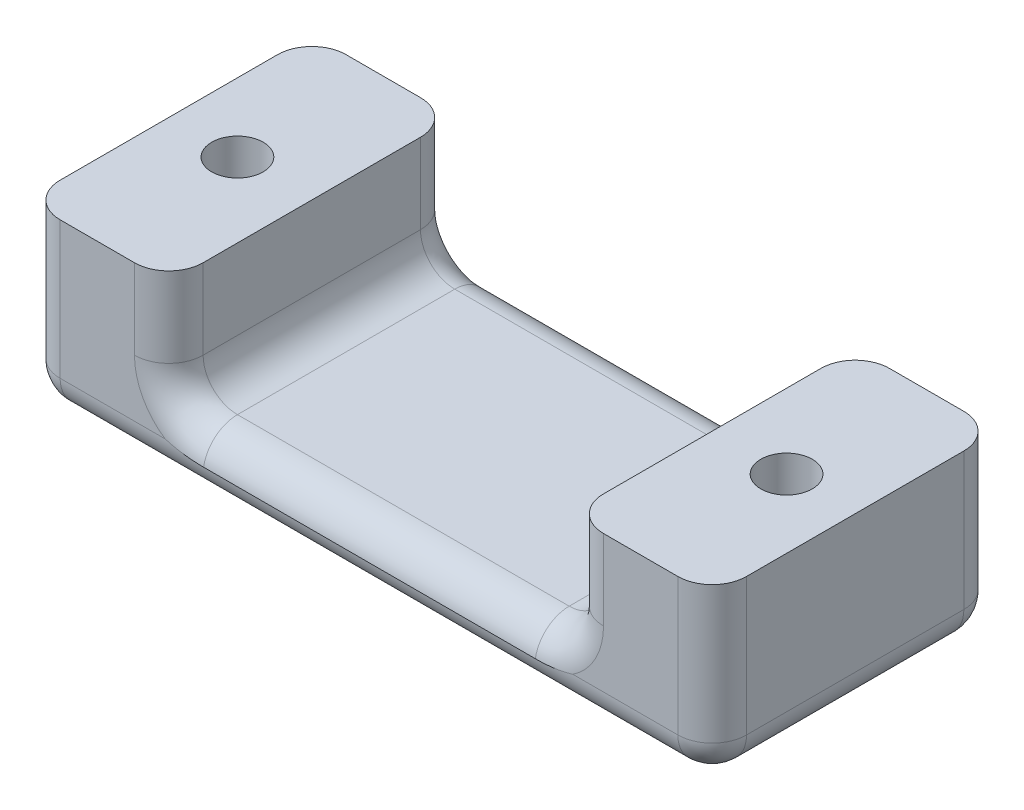
ISO-10303-21;
HEADER;
FILE_DESCRIPTION(('STEP AP214'),'2;1');
FILE_NAME('part.step','',(''),(''),'','','');
FILE_SCHEMA(('AUTOMOTIVE_DESIGN { 1 0 10303 214 1 1 1 1 }'));
ENDSEC;
DATA;
#1=APPLICATION_CONTEXT('core data for automotive mechanical design processes');
#2=APPLICATION_PROTOCOL_DEFINITION('international standard','automotive_design',2000,#1);
#3=PRODUCT_CONTEXT('',#1,'mechanical');
#4=PRODUCT('Part','Part','',(#3));
#5=PRODUCT_RELATED_PRODUCT_CATEGORY('part','',(#4));
#6=PRODUCT_DEFINITION_FORMATION('','',#4);
#7=PRODUCT_DEFINITION_CONTEXT('part definition',#1,'design');
#8=PRODUCT_DEFINITION('design','',#6,#7);
#9=PRODUCT_DEFINITION_SHAPE('','',#8);
#10=(LENGTH_UNIT() NAMED_UNIT(*) SI_UNIT(.MILLI.,.METRE.));
#11=(NAMED_UNIT(*) PLANE_ANGLE_UNIT() SI_UNIT($,.RADIAN.));
#12=(NAMED_UNIT(*) SI_UNIT($,.STERADIAN.) SOLID_ANGLE_UNIT());
#13=UNCERTAINTY_MEASURE_WITH_UNIT(LENGTH_MEASURE(1.E-05),#10,'distance_accuracy_value','');
#14=(GEOMETRIC_REPRESENTATION_CONTEXT(3) GLOBAL_UNCERTAINTY_ASSIGNED_CONTEXT((#13)) GLOBAL_UNIT_ASSIGNED_CONTEXT((#10,
#11,#12)) REPRESENTATION_CONTEXT('',''));
#15=CARTESIAN_POINT('',(0.,0.,0.));
#16=DIRECTION('',(0.,0.,1.));
#17=DIRECTION('',(1.,0.,0.));
#18=AXIS2_PLACEMENT_3D('',#15,#16,#17);
#19=CARTESIAN_POINT('',(0.,5.,-25.));
#20=DIRECTION('',(0.,0.,1.));
#21=DIRECTION('',(1.,0.,0.));
#22=AXIS2_PLACEMENT_3D('',#19,#20,#21);
#23=PLANE('',#22);
#24=CARTESIAN_POINT('',(44.5,8.,-25.));
#25=DIRECTION('',(0.,0.,1.));
#26=DIRECTION('',(1.,0.,0.));
#27=AXIS2_PLACEMENT_3D('',#24,#25,#26);
#28=CIRCLE('',#27,6.);
#29=CARTESIAN_POINT('',(47.8166247903554,3.,-25.));
#30=VERTEX_POINT('',#29);
#31=CARTESIAN_POINT('',(50.5,8.,-25.));
#32=VERTEX_POINT('',#31);
#33=EDGE_CURVE('E546',#30,#32,#28,.T.);
#34=ORIENTED_EDGE('',*,*,#33,.T.);
#35=DIRECTION('',(0.,-1.,0.));
#36=VECTOR('',#35,1.);
#37=CARTESIAN_POINT('',(50.5,5.,-25.));
#38=LINE('',#37,#36);
#39=CARTESIAN_POINT('',(50.5,15.,-25.));
#40=VERTEX_POINT('',#39);
#41=EDGE_CURVE('E552',#32,#40,#38,.F.);
#42=ORIENTED_EDGE('',*,*,#41,.T.);
#43=DIRECTION('',(-1.,0.,0.));
#44=VECTOR('',#43,1.);
#45=CARTESIAN_POINT('',(60.,15.,-25.));
#46=LINE('',#45,#44);
#47=CARTESIAN_POINT('',(57.,15.,-25.));
#48=VERTEX_POINT('',#47);
#49=EDGE_CURVE('E437',#48,#40,#46,.T.);
#50=ORIENTED_EDGE('',*,*,#49,.F.);
#51=DIRECTION('',(0.,-1.,0.));
#52=VECTOR('',#51,1.);
#53=CARTESIAN_POINT('',(57.,5.,-25.));
#54=LINE('',#53,#52);
#55=CARTESIAN_POINT('',(57.,3.,-25.));
#56=VERTEX_POINT('',#55);
#57=EDGE_CURVE('E549',#48,#56,#54,.T.);
#58=ORIENTED_EDGE('',*,*,#57,.T.);
#59=DIRECTION('',(-1.,0.,0.));
#60=VECTOR('',#59,1.);
#61=CARTESIAN_POINT('',(0.,3.,-25.));
#62=LINE('',#61,#60);
#63=EDGE_CURVE('E543',#56,#30,#62,.T.);
#64=ORIENTED_EDGE('',*,*,#63,.T.);
#65=EDGE_LOOP('',(#34,#42,#50,#58,#64));
#66=FACE_BOUND('',#65,.T.);
#67=ADVANCED_FACE('F40',(#66),#23,.F.);
#68=CARTESIAN_POINT('',(0.,5.,0.));
#69=DIRECTION('',(0.,0.,-1.));
#70=DIRECTION('',(-1.,0.,0.));
#71=AXIS2_PLACEMENT_3D('',#68,#69,#70);
#72=PLANE('',#71);
#73=CARTESIAN_POINT('',(15.5,8.,0.));
#74=DIRECTION('',(0.,0.,-1.));
#75=DIRECTION('',(-1.,0.,0.));
#76=AXIS2_PLACEMENT_3D('',#73,#74,#75);
#77=CIRCLE('',#76,6.);
#78=CARTESIAN_POINT('',(12.1833752096446,3.,0.));
#79=VERTEX_POINT('',#78);
#80=CARTESIAN_POINT('',(9.49999999999999,8.,0.));
#81=VERTEX_POINT('',#80);
#82=EDGE_CURVE('E490',#79,#81,#77,.T.);
#83=ORIENTED_EDGE('',*,*,#82,.T.);
#84=DIRECTION('',(0.,-1.,0.));
#85=VECTOR('',#84,1.);
#86=CARTESIAN_POINT('',(9.49999999999999,5.,0.));
#87=LINE('',#86,#85);
#88=CARTESIAN_POINT('',(9.49999999999999,15.,0.));
#89=VERTEX_POINT('',#88);
#90=EDGE_CURVE('E496',#81,#89,#87,.F.);
#91=ORIENTED_EDGE('',*,*,#90,.T.);
#92=DIRECTION('',(1.,0.,0.));
#93=VECTOR('',#92,1.);
#94=CARTESIAN_POINT('',(0.,15.,0.));
#95=LINE('',#94,#93);
#96=CARTESIAN_POINT('',(3.,15.,0.));
#97=VERTEX_POINT('',#96);
#98=EDGE_CURVE('E454',#97,#89,#95,.T.);
#99=ORIENTED_EDGE('',*,*,#98,.F.);
#100=DIRECTION('',(0.,-1.,0.));
#101=VECTOR('',#100,1.);
#102=CARTESIAN_POINT('',(3.,5.,0.));
#103=LINE('',#102,#101);
#104=CARTESIAN_POINT('',(3.,3.,0.));
#105=VERTEX_POINT('',#104);
#106=EDGE_CURVE('E493',#97,#105,#103,.T.);
#107=ORIENTED_EDGE('',*,*,#106,.T.);
#108=DIRECTION('',(1.,0.,0.));
#109=VECTOR('',#108,1.);
#110=CARTESIAN_POINT('',(60.,3.,0.));
#111=LINE('',#110,#109);
#112=EDGE_CURVE('E487',#105,#79,#111,.T.);
#113=ORIENTED_EDGE('',*,*,#112,.T.);
#114=EDGE_LOOP('',(#83,#91,#99,#107,#113));
#115=FACE_BOUND('',#114,.T.);
#116=ADVANCED_FACE('F653',(#115),#72,.F.);
#117=CARTESIAN_POINT('',(0.,5.,0.));
#118=DIRECTION('',(0.,-1.,0.));
#119=DIRECTION('',(0.,0.,-1.));
#120=AXIS2_PLACEMENT_3D('',#117,#118,#119);
#121=PLANE('',#120);
#122=DIRECTION('',(1.,0.,0.));
#123=VECTOR('',#122,1.);
#124=CARTESIAN_POINT('',(0.,5.,-3.));
#125=LINE('',#124,#123);
#126=CARTESIAN_POINT('',(15.5,5.,-3.));
#127=VERTEX_POINT('',#126);
#128=CARTESIAN_POINT('',(44.5,5.,-3.));
#129=VERTEX_POINT('',#128);
#130=EDGE_CURVE('E578',#127,#129,#125,.T.);
#131=ORIENTED_EDGE('',*,*,#130,.T.);
#132=DIRECTION('',(0.,0.,1.));
#133=VECTOR('',#132,1.);
#134=CARTESIAN_POINT('',(44.5,5.,-25.));
#135=LINE('',#134,#133);
#136=CARTESIAN_POINT('',(44.5,5.,-22.));
#137=VERTEX_POINT('',#136);
#138=EDGE_CURVE('E225',#129,#137,#135,.F.);
#139=ORIENTED_EDGE('',*,*,#138,.T.);
#140=DIRECTION('',(-1.,0.,0.));
#141=VECTOR('',#140,1.);
#142=CARTESIAN_POINT('',(0.,5.,-22.));
#143=LINE('',#142,#141);
#144=CARTESIAN_POINT('',(15.5,5.,-22.));
#145=VERTEX_POINT('',#144);
#146=EDGE_CURVE('E575',#137,#145,#143,.T.);
#147=ORIENTED_EDGE('',*,*,#146,.T.);
#148=DIRECTION('',(0.,0.,-1.));
#149=VECTOR('',#148,1.);
#150=CARTESIAN_POINT('',(15.5,5.,0.));
#151=LINE('',#150,#149);
#152=EDGE_CURVE('E572',#145,#127,#151,.F.);
#153=ORIENTED_EDGE('',*,*,#152,.T.);
#154=EDGE_LOOP('',(#131,#139,#147,#153));
#155=FACE_BOUND('',#154,.T.);
#156=ADVANCED_FACE('F585',(#155),#121,.F.);
#157=CARTESIAN_POINT('',(0.,5.,0.));
#158=DIRECTION('',(1.,0.,0.));
#159=DIRECTION('',(0.,0.,-1.));
#160=AXIS2_PLACEMENT_3D('',#157,#158,#159);
#161=PLANE('',#160);
#162=DIRECTION('',(0.,0.,1.));
#163=VECTOR('',#162,1.);
#164=CARTESIAN_POINT('',(0.,3.,0.));
#165=LINE('',#164,#163);
#166=CARTESIAN_POINT('',(0.,3.,-22.));
#167=VERTEX_POINT('',#166);
#168=CARTESIAN_POINT('',(0.,3.,-3.));
#169=VERTEX_POINT('',#168);
#170=EDGE_CURVE('E232',#167,#169,#165,.T.);
#171=ORIENTED_EDGE('',*,*,#170,.T.);
#172=DIRECTION('',(0.,-1.,0.));
#173=VECTOR('',#172,1.);
#174=CARTESIAN_POINT('',(0.,5.,-3.));
#175=LINE('',#174,#173);
#176=CARTESIAN_POINT('',(0.,15.,-3.));
#177=VERTEX_POINT('',#176);
#178=EDGE_CURVE('E569',#169,#177,#175,.F.);
#179=ORIENTED_EDGE('',*,*,#178,.T.);
#180=DIRECTION('',(0.,0.,1.));
#181=VECTOR('',#180,1.);
#182=CARTESIAN_POINT('',(0.,15.,-25.));
#183=LINE('',#182,#181);
#184=CARTESIAN_POINT('',(0.,15.,-22.));
#185=VERTEX_POINT('',#184);
#186=EDGE_CURVE('E450',#185,#177,#183,.T.);
#187=ORIENTED_EDGE('',*,*,#186,.F.);
#188=DIRECTION('',(0.,-1.,0.));
#189=VECTOR('',#188,1.);
#190=CARTESIAN_POINT('',(0.,5.,-22.));
#191=LINE('',#190,#189);
#192=EDGE_CURVE('E566',#185,#167,#191,.T.);
#193=ORIENTED_EDGE('',*,*,#192,.T.);
#194=EDGE_LOOP('',(#171,#179,#187,#193));
#195=FACE_BOUND('',#194,.T.);
#196=ADVANCED_FACE('F729',(#195),#161,.F.);
#197=DIRECTION('',(1.,0.,0.));
#198=VECTOR('',#197,1.);
#199=CARTESIAN_POINT('',(60.,15.,0.));
#200=LINE('',#199,#198);
#201=CARTESIAN_POINT('',(50.5,15.,0.));
#202=VERTEX_POINT('',#201);
#203=CARTESIAN_POINT('',(57.,15.,0.));
#204=VERTEX_POINT('',#203);
#205=EDGE_CURVE('E446',#202,#204,#200,.T.);
#206=ORIENTED_EDGE('',*,*,#205,.F.);
#207=DIRECTION('',(0.,-1.,0.));
#208=VECTOR('',#207,1.);
#209=CARTESIAN_POINT('',(50.5,5.,0.));
#210=LINE('',#209,#208);
#211=CARTESIAN_POINT('',(50.5,8.,0.));
#212=VERTEX_POINT('',#211);
#213=EDGE_CURVE('E483',#202,#212,#210,.T.);
#214=ORIENTED_EDGE('',*,*,#213,.T.);
#215=CARTESIAN_POINT('',(44.5,8.,0.));
#216=DIRECTION('',(0.,0.,-1.));
#217=DIRECTION('',(-1.,0.,0.));
#218=AXIS2_PLACEMENT_3D('',#215,#216,#217);
#219=CIRCLE('',#218,6.);
#220=CARTESIAN_POINT('',(47.8166247903554,3.,0.));
#221=VERTEX_POINT('',#220);
#222=EDGE_CURVE('E480',#212,#221,#219,.T.);
#223=ORIENTED_EDGE('',*,*,#222,.T.);
#224=DIRECTION('',(1.,0.,0.));
#225=VECTOR('',#224,1.);
#226=CARTESIAN_POINT('',(60.,3.,0.));
#227=LINE('',#226,#225);
#228=CARTESIAN_POINT('',(57.,3.,0.));
#229=VERTEX_POINT('',#228);
#230=EDGE_CURVE('E474',#221,#229,#227,.T.);
#231=ORIENTED_EDGE('',*,*,#230,.T.);
#232=DIRECTION('',(0.,-1.,0.));
#233=VECTOR('',#232,1.);
#234=CARTESIAN_POINT('',(57.,5.,0.));
#235=LINE('',#234,#233);
#236=EDGE_CURVE('E477',#229,#204,#235,.F.);
#237=ORIENTED_EDGE('',*,*,#236,.T.);
#238=EDGE_LOOP('',(#206,#214,#223,#231,#237));
#239=FACE_BOUND('',#238,.T.);
#240=ADVANCED_FACE('F617',(#239),#72,.F.);
#241=CARTESIAN_POINT('',(60.,5.,0.));
#242=DIRECTION('',(-1.,0.,0.));
#243=DIRECTION('',(0.,0.,1.));
#244=AXIS2_PLACEMENT_3D('',#241,#242,#243);
#245=PLANE('',#244);
#246=DIRECTION('',(0.,0.,-1.));
#247=VECTOR('',#246,1.);
#248=CARTESIAN_POINT('',(60.,3.,-25.));
#249=LINE('',#248,#247);
#250=CARTESIAN_POINT('',(60.,3.,-3.));
#251=VERTEX_POINT('',#250);
#252=CARTESIAN_POINT('',(60.,3.,-22.));
#253=VERTEX_POINT('',#252);
#254=EDGE_CURVE('E555',#251,#253,#249,.T.);
#255=ORIENTED_EDGE('',*,*,#254,.T.);
#256=DIRECTION('',(0.,-1.,0.));
#257=VECTOR('',#256,1.);
#258=CARTESIAN_POINT('',(60.,5.,-22.));
#259=LINE('',#258,#257);
#260=CARTESIAN_POINT('',(60.,15.,-22.));
#261=VERTEX_POINT('',#260);
#262=EDGE_CURVE('E561',#253,#261,#259,.F.);
#263=ORIENTED_EDGE('',*,*,#262,.T.);
#264=DIRECTION('',(0.,0.,-1.));
#265=VECTOR('',#264,1.);
#266=CARTESIAN_POINT('',(60.,15.,-25.));
#267=LINE('',#266,#265);
#268=CARTESIAN_POINT('',(60.,15.,-3.));
#269=VERTEX_POINT('',#268);
#270=EDGE_CURVE('E433',#269,#261,#267,.T.);
#271=ORIENTED_EDGE('',*,*,#270,.F.);
#272=DIRECTION('',(0.,-1.,0.));
#273=VECTOR('',#272,1.);
#274=CARTESIAN_POINT('',(60.,5.,-3.));
#275=LINE('',#274,#273);
#276=EDGE_CURVE('E558',#269,#251,#275,.T.);
#277=ORIENTED_EDGE('',*,*,#276,.T.);
#278=EDGE_LOOP('',(#255,#263,#271,#277));
#279=FACE_BOUND('',#278,.T.);
#280=ADVANCED_FACE('F627',(#279),#245,.F.);
#281=DIRECTION('',(-1.,0.,0.));
#282=VECTOR('',#281,1.);
#283=CARTESIAN_POINT('',(0.,15.,-25.));
#284=LINE('',#283,#282);
#285=CARTESIAN_POINT('',(9.49999999999999,15.,-25.));
#286=VERTEX_POINT('',#285);
#287=CARTESIAN_POINT('',(3.,15.,-25.));
#288=VERTEX_POINT('',#287);
#289=EDGE_CURVE('E460',#286,#288,#284,.T.);
#290=ORIENTED_EDGE('',*,*,#289,.F.);
#291=DIRECTION('',(0.,-1.,0.));
#292=VECTOR('',#291,1.);
#293=CARTESIAN_POINT('',(9.49999999999999,5.,-25.));
#294=LINE('',#293,#292);
#295=CARTESIAN_POINT('',(9.49999999999999,8.,-25.));
#296=VERTEX_POINT('',#295);
#297=EDGE_CURVE('E540',#286,#296,#294,.T.);
#298=ORIENTED_EDGE('',*,*,#297,.T.);
#299=CARTESIAN_POINT('',(15.5,8.,-25.));
#300=DIRECTION('',(0.,0.,1.));
#301=DIRECTION('',(1.,0.,0.));
#302=AXIS2_PLACEMENT_3D('',#299,#300,#301);
#303=CIRCLE('',#302,6.);
#304=CARTESIAN_POINT('',(12.1833752096446,3.,-25.));
#305=VERTEX_POINT('',#304);
#306=EDGE_CURVE('E537',#296,#305,#303,.T.);
#307=ORIENTED_EDGE('',*,*,#306,.T.);
#308=DIRECTION('',(-1.,0.,0.));
#309=VECTOR('',#308,1.);
#310=CARTESIAN_POINT('',(0.,3.,-25.));
#311=LINE('',#310,#309);
#312=CARTESIAN_POINT('',(3.,3.,-25.));
#313=VERTEX_POINT('',#312);
#314=EDGE_CURVE('E531',#305,#313,#311,.T.);
#315=ORIENTED_EDGE('',*,*,#314,.T.);
#316=DIRECTION('',(0.,-1.,0.));
#317=VECTOR('',#316,1.);
#318=CARTESIAN_POINT('',(3.,5.,-25.));
#319=LINE('',#318,#317);
#320=EDGE_CURVE('E534',#313,#288,#319,.F.);
#321=ORIENTED_EDGE('',*,*,#320,.T.);
#322=EDGE_LOOP('',(#290,#298,#307,#315,#321));
#323=FACE_BOUND('',#322,.T.);
#324=ADVANCED_FACE('F656',(#323),#23,.F.);
#325=CARTESIAN_POINT('',(0.,0.,0.));
#326=DIRECTION('',(0.,-1.,0.));
#327=DIRECTION('',(0.,0.,-1.));
#328=AXIS2_PLACEMENT_3D('',#325,#326,#327);
#329=PLANE('',#328);
#330=DIRECTION('',(-1.,0.,0.));
#331=VECTOR('',#330,1.);
#332=CARTESIAN_POINT('',(60.,0.,-22.));
#333=LINE('',#332,#331);
#334=CARTESIAN_POINT('',(3.,0.,-22.));
#335=VERTEX_POINT('',#334);
#336=CARTESIAN_POINT('',(57.,0.,-22.));
#337=VERTEX_POINT('',#336);
#338=EDGE_CURVE('E219',#335,#337,#333,.F.);
#339=ORIENTED_EDGE('',*,*,#338,.T.);
#340=DIRECTION('',(0.,0.,-1.));
#341=VECTOR('',#340,1.);
#342=CARTESIAN_POINT('',(57.,0.,0.));
#343=LINE('',#342,#341);
#344=CARTESIAN_POINT('',(57.,0.,-3.));
#345=VERTEX_POINT('',#344);
#346=EDGE_CURVE('E11',#337,#345,#343,.F.);
#347=ORIENTED_EDGE('',*,*,#346,.T.);
#348=DIRECTION('',(1.,0.,0.));
#349=VECTOR('',#348,1.);
#350=CARTESIAN_POINT('',(0.,0.,-3.));
#351=LINE('',#350,#349);
#352=CARTESIAN_POINT('',(3.,0.,-3.));
#353=VERTEX_POINT('',#352);
#354=EDGE_CURVE('E51',#345,#353,#351,.F.);
#355=ORIENTED_EDGE('',*,*,#354,.T.);
#356=DIRECTION('',(0.,0.,1.));
#357=VECTOR('',#356,1.);
#358=CARTESIAN_POINT('',(3.,0.,-25.));
#359=LINE('',#358,#357);
#360=EDGE_CURVE('E214',#353,#335,#359,.F.);
#361=ORIENTED_EDGE('',*,*,#360,.T.);
#362=EDGE_LOOP('',(#339,#347,#355,#361));
#363=FACE_BOUND('',#362,.T.);
#364=CARTESIAN_POINT('',(6.,0.,-12.5));
#365=DIRECTION('',(0.,-1.,0.));
#366=DIRECTION('',(0.,0.,-1.));
#367=AXIS2_PLACEMENT_3D('',#364,#365,#366);
#368=CIRCLE('',#367,2.25);
#369=CARTESIAN_POINT('',(6.,0.,-14.75));
#370=VERTEX_POINT('',#369);
#371=EDGE_CURVE('E429',#370,#370,#368,.T.);
#372=ORIENTED_EDGE('',*,*,#371,.F.);
#373=EDGE_LOOP('',(#372));
#374=FACE_BOUND('',#373,.T.);
#375=CARTESIAN_POINT('',(54.,0.,-12.5));
#376=DIRECTION('',(0.,-1.,0.));
#377=DIRECTION('',(0.,0.,1.));
#378=AXIS2_PLACEMENT_3D('',#375,#376,#377);
#379=CIRCLE('',#378,2.25);
#380=CARTESIAN_POINT('',(54.,0.,-10.25));
#381=VERTEX_POINT('',#380);
#382=EDGE_CURVE('E418',#381,#381,#379,.T.);
#383=ORIENTED_EDGE('',*,*,#382,.F.);
#384=EDGE_LOOP('',(#383));
#385=FACE_BOUND('',#384,.T.);
#386=ADVANCED_FACE('F216',(#363,#374,#385),#329,.T.);
#387=CARTESIAN_POINT('',(12.5,15.,-25.));
#388=DIRECTION('',(-1.,0.,0.));
#389=DIRECTION('',(0.,0.,1.));
#390=AXIS2_PLACEMENT_3D('',#387,#388,#389);
#391=PLANE('',#390);
#392=DIRECTION('',(0.,0.,-1.));
#393=VECTOR('',#392,1.);
#394=CARTESIAN_POINT('',(12.5,15.,-25.));
#395=LINE('',#394,#393);
#396=CARTESIAN_POINT('',(12.5,15.,-3.));
#397=VERTEX_POINT('',#396);
#398=CARTESIAN_POINT('',(12.5,15.,-22.));
#399=VERTEX_POINT('',#398);
#400=EDGE_CURVE('E457',#397,#399,#395,.T.);
#401=ORIENTED_EDGE('',*,*,#400,.F.);
#402=DIRECTION('',(0.,-1.,0.));
#403=VECTOR('',#402,1.);
#404=CARTESIAN_POINT('',(12.5,15.,-3.));
#405=LINE('',#404,#403);
#406=CARTESIAN_POINT('',(12.5,8.,-3.));
#407=VERTEX_POINT('',#406);
#408=EDGE_CURVE('E470',#397,#407,#405,.T.);
#409=ORIENTED_EDGE('',*,*,#408,.T.);
#410=DIRECTION('',(0.,0.,-1.));
#411=VECTOR('',#410,1.);
#412=CARTESIAN_POINT('',(12.5,8.,-25.));
#413=LINE('',#412,#411);
#414=CARTESIAN_POINT('',(12.5,8.,-22.));
#415=VERTEX_POINT('',#414);
#416=EDGE_CURVE('E464',#407,#415,#413,.T.);
#417=ORIENTED_EDGE('',*,*,#416,.T.);
#418=DIRECTION('',(0.,-1.,0.));
#419=VECTOR('',#418,1.);
#420=CARTESIAN_POINT('',(12.5,15.,-22.));
#421=LINE('',#420,#419);
#422=EDGE_CURVE('E467',#415,#399,#421,.F.);
#423=ORIENTED_EDGE('',*,*,#422,.T.);
#424=EDGE_LOOP('',(#401,#409,#417,#423));
#425=FACE_BOUND('',#424,.T.);
#426=ADVANCED_FACE('F671',(#425),#391,.F.);
#427=CARTESIAN_POINT('',(0.,15.,0.));
#428=DIRECTION('',(0.,1.,0.));
#429=DIRECTION('',(0.,0.,1.));
#430=AXIS2_PLACEMENT_3D('',#427,#428,#429);
#431=PLANE('',#430);
#432=CARTESIAN_POINT('',(6.,15.,-12.5));
#433=DIRECTION('',(0.,-1.,0.));
#434=DIRECTION('',(0.,0.,-1.));
#435=AXIS2_PLACEMENT_3D('',#432,#433,#434);
#436=CIRCLE('',#435,2.25);
#437=CARTESIAN_POINT('',(6.,15.,-14.75));
#438=VERTEX_POINT('',#437);
#439=EDGE_CURVE('E438',#438,#438,#436,.T.);
#440=ORIENTED_EDGE('',*,*,#439,.T.);
#441=EDGE_LOOP('',(#440));
#442=FACE_BOUND('',#441,.T.);
#443=ORIENTED_EDGE('',*,*,#98,.T.);
#444=CARTESIAN_POINT('',(9.49999999999999,15.,-3.));
#445=DIRECTION('',(0.,1.,0.));
#446=DIRECTION('',(0.,0.,1.));
#447=AXIS2_PLACEMENT_3D('',#444,#445,#446);
#448=CIRCLE('',#447,3.);
#449=EDGE_CURVE('E91',#89,#397,#448,.T.);
#450=ORIENTED_EDGE('',*,*,#449,.T.);
#451=ORIENTED_EDGE('',*,*,#400,.T.);
#452=CARTESIAN_POINT('',(9.49999999999999,15.,-22.));
#453=DIRECTION('',(0.,1.,0.));
#454=DIRECTION('',(0.,0.,1.));
#455=AXIS2_PLACEMENT_3D('',#452,#453,#454);
#456=CIRCLE('',#455,3.);
#457=EDGE_CURVE('E505',#399,#286,#456,.T.);
#458=ORIENTED_EDGE('',*,*,#457,.T.);
#459=ORIENTED_EDGE('',*,*,#289,.T.);
#460=CARTESIAN_POINT('',(3.,15.,-22.));
#461=DIRECTION('',(0.,1.,0.));
#462=DIRECTION('',(0.,0.,1.));
#463=AXIS2_PLACEMENT_3D('',#460,#461,#462);
#464=CIRCLE('',#463,3.);
#465=EDGE_CURVE('E499',#288,#185,#464,.T.);
#466=ORIENTED_EDGE('',*,*,#465,.T.);
#467=ORIENTED_EDGE('',*,*,#186,.T.);
#468=CARTESIAN_POINT('',(3.,15.,-3.));
#469=DIRECTION('',(0.,1.,0.));
#470=DIRECTION('',(0.,0.,1.));
#471=AXIS2_PLACEMENT_3D('',#468,#469,#470);
#472=CIRCLE('',#471,3.);
#473=EDGE_CURVE('E502',#177,#97,#472,.T.);
#474=ORIENTED_EDGE('',*,*,#473,.T.);
#475=EDGE_LOOP('',(#443,#450,#451,#458,#459,#466,#467,#474));
#476=FACE_BOUND('',#475,.T.);
#477=ADVANCED_FACE('F713',(#442,#476),#431,.T.);
#478=CARTESIAN_POINT('',(47.5,15.,-25.));
#479=DIRECTION('',(1.,0.,0.));
#480=DIRECTION('',(0.,0.,-1.));
#481=AXIS2_PLACEMENT_3D('',#478,#479,#480);
#482=PLANE('',#481);
#483=DIRECTION('',(0.,0.,1.));
#484=VECTOR('',#483,1.);
#485=CARTESIAN_POINT('',(47.5,8.,0.));
#486=LINE('',#485,#484);
#487=CARTESIAN_POINT('',(47.5,8.,-22.));
#488=VERTEX_POINT('',#487);
#489=CARTESIAN_POINT('',(47.5,8.,-3.));
#490=VERTEX_POINT('',#489);
#491=EDGE_CURVE('E510',#488,#490,#486,.T.);
#492=ORIENTED_EDGE('',*,*,#491,.T.);
#493=DIRECTION('',(0.,-1.,0.));
#494=VECTOR('',#493,1.);
#495=CARTESIAN_POINT('',(47.5,15.,-3.));
#496=LINE('',#495,#494);
#497=CARTESIAN_POINT('',(47.5,15.,-3.));
#498=VERTEX_POINT('',#497);
#499=EDGE_CURVE('E516',#490,#498,#496,.F.);
#500=ORIENTED_EDGE('',*,*,#499,.T.);
#501=DIRECTION('',(0.,0.,1.));
#502=VECTOR('',#501,1.);
#503=CARTESIAN_POINT('',(47.5,15.,-25.));
#504=LINE('',#503,#502);
#505=CARTESIAN_POINT('',(47.5,15.,-22.));
#506=VERTEX_POINT('',#505);
#507=EDGE_CURVE('E442',#506,#498,#504,.T.);
#508=ORIENTED_EDGE('',*,*,#507,.F.);
#509=DIRECTION('',(0.,-1.,0.));
#510=VECTOR('',#509,1.);
#511=CARTESIAN_POINT('',(47.5,15.,-22.));
#512=LINE('',#511,#510);
#513=EDGE_CURVE('E513',#506,#488,#512,.T.);
#514=ORIENTED_EDGE('',*,*,#513,.T.);
#515=EDGE_LOOP('',(#492,#500,#508,#514));
#516=FACE_BOUND('',#515,.T.);
#517=ADVANCED_FACE('F711',(#516),#482,.F.);
#518=CARTESIAN_POINT('',(0.,15.,0.));
#519=DIRECTION('',(0.,-1.,0.));
#520=DIRECTION('',(0.,0.,-1.));
#521=AXIS2_PLACEMENT_3D('',#518,#519,#520);
#522=PLANE('',#521);
#523=CARTESIAN_POINT('',(54.,15.,-12.5));
#524=DIRECTION('',(0.,-1.,0.));
#525=DIRECTION('',(0.,0.,1.));
#526=AXIS2_PLACEMENT_3D('',#523,#524,#525);
#527=CIRCLE('',#526,2.25);
#528=CARTESIAN_POINT('',(54.,15.,-10.25));
#529=VERTEX_POINT('',#528);
#530=EDGE_CURVE('E423',#529,#529,#527,.T.);
#531=ORIENTED_EDGE('',*,*,#530,.T.);
#532=EDGE_LOOP('',(#531));
#533=FACE_BOUND('',#532,.T.);
#534=ORIENTED_EDGE('',*,*,#507,.T.);
#535=CARTESIAN_POINT('',(50.5,15.,-3.));
#536=DIRECTION('',(0.,-1.,0.));
#537=DIRECTION('',(0.,0.,-1.));
#538=AXIS2_PLACEMENT_3D('',#535,#536,#537);
#539=CIRCLE('',#538,3.);
#540=EDGE_CURVE('E528',#498,#202,#539,.F.);
#541=ORIENTED_EDGE('',*,*,#540,.T.);
#542=ORIENTED_EDGE('',*,*,#205,.T.);
#543=CARTESIAN_POINT('',(57.,15.,-3.));
#544=DIRECTION('',(0.,-1.,0.));
#545=DIRECTION('',(0.,0.,-1.));
#546=AXIS2_PLACEMENT_3D('',#543,#544,#545);
#547=CIRCLE('',#546,3.);
#548=EDGE_CURVE('E519',#204,#269,#547,.F.);
#549=ORIENTED_EDGE('',*,*,#548,.T.);
#550=ORIENTED_EDGE('',*,*,#270,.T.);
#551=CARTESIAN_POINT('',(57.,15.,-22.));
#552=DIRECTION('',(0.,-1.,0.));
#553=DIRECTION('',(0.,0.,-1.));
#554=AXIS2_PLACEMENT_3D('',#551,#552,#553);
#555=CIRCLE('',#554,3.);
#556=EDGE_CURVE('E522',#261,#48,#555,.F.);
#557=ORIENTED_EDGE('',*,*,#556,.T.);
#558=ORIENTED_EDGE('',*,*,#49,.T.);
#559=CARTESIAN_POINT('',(50.5,15.,-22.));
#560=DIRECTION('',(0.,-1.,0.));
#561=DIRECTION('',(0.,0.,-1.));
#562=AXIS2_PLACEMENT_3D('',#559,#560,#561);
#563=CIRCLE('',#562,3.);
#564=EDGE_CURVE('E525',#40,#506,#563,.F.);
#565=ORIENTED_EDGE('',*,*,#564,.T.);
#566=EDGE_LOOP('',(#534,#541,#542,#549,#550,#557,#558,#565));
#567=FACE_BOUND('',#566,.T.);
#568=ADVANCED_FACE('F621',(#533,#567),#522,.F.);
#569=CARTESIAN_POINT('',(54.,15.,-12.5));
#570=DIRECTION('',(0.,-1.,0.));
#571=DIRECTION('',(0.,0.,-1.));
#572=AXIS2_PLACEMENT_3D('',#569,#570,#571);
#573=CYLINDRICAL_SURFACE('',#572,2.25);
#574=ORIENTED_EDGE('',*,*,#530,.F.);
#575=EDGE_LOOP('',(#574));
#576=FACE_BOUND('',#575,.T.);
#577=ORIENTED_EDGE('',*,*,#382,.T.);
#578=EDGE_LOOP('',(#577));
#579=FACE_BOUND('',#578,.T.);
#580=ADVANCED_FACE('F704',(#576,#579),#573,.F.);
#581=CARTESIAN_POINT('',(6.,15.,-12.5));
#582=DIRECTION('',(0.,-1.,0.));
#583=DIRECTION('',(0.,0.,-1.));
#584=AXIS2_PLACEMENT_3D('',#581,#582,#583);
#585=CYLINDRICAL_SURFACE('',#584,2.25);
#586=ORIENTED_EDGE('',*,*,#439,.F.);
#587=EDGE_LOOP('',(#586));
#588=FACE_BOUND('',#587,.T.);
#589=ORIENTED_EDGE('',*,*,#371,.T.);
#590=EDGE_LOOP('',(#589));
#591=FACE_BOUND('',#590,.T.);
#592=ADVANCED_FACE('F698',(#588,#591),#585,.F.);
#593=CARTESIAN_POINT('',(50.5,15.,-22.));
#594=DIRECTION('',(0.,-1.,0.));
#595=DIRECTION('',(0.,0.,-1.));
#596=AXIS2_PLACEMENT_3D('',#593,#594,#595);
#597=CYLINDRICAL_SURFACE('',#596,3.);
#598=ORIENTED_EDGE('',*,*,#564,.F.);
#599=ORIENTED_EDGE('',*,*,#41,.F.);
#600=CARTESIAN_POINT('',(50.5,8.,-22.));
#601=DIRECTION('',(0.,-1.,0.));
#602=DIRECTION('',(0.,0.,-1.));
#603=AXIS2_PLACEMENT_3D('',#600,#601,#602);
#604=CIRCLE('',#603,3.);
#605=EDGE_CURVE('E44',#488,#32,#604,.T.);
#606=ORIENTED_EDGE('',*,*,#605,.F.);
#607=ORIENTED_EDGE('',*,*,#513,.F.);
#608=EDGE_LOOP('',(#598,#599,#606,#607));
#609=FACE_BOUND('',#608,.T.);
#610=ADVANCED_FACE('F42',(#609),#597,.T.);
#611=CARTESIAN_POINT('',(57.,5.,-22.));
#612=DIRECTION('',(0.,-1.,0.));
#613=DIRECTION('',(0.,0.,-1.));
#614=AXIS2_PLACEMENT_3D('',#611,#612,#613);
#615=CYLINDRICAL_SURFACE('',#614,3.);
#616=ORIENTED_EDGE('',*,*,#556,.F.);
#617=ORIENTED_EDGE('',*,*,#262,.F.);
#618=CARTESIAN_POINT('',(57.,3.,-22.));
#619=DIRECTION('',(0.,-1.,0.));
#620=DIRECTION('',(0.,0.,-1.));
#621=AXIS2_PLACEMENT_3D('',#618,#619,#620);
#622=CIRCLE('',#621,3.);
#623=EDGE_CURVE('E410',#56,#253,#622,.T.);
#624=ORIENTED_EDGE('',*,*,#623,.F.);
#625=ORIENTED_EDGE('',*,*,#57,.F.);
#626=EDGE_LOOP('',(#616,#617,#624,#625));
#627=FACE_BOUND('',#626,.T.);
#628=ADVANCED_FACE('F395',(#627),#615,.T.);
#629=CARTESIAN_POINT('',(44.5,8.,-22.));
#630=DIRECTION('',(0.,0.,1.));
#631=DIRECTION('',(1.,0.,0.));
#632=AXIS2_PLACEMENT_3D('',#629,#630,#631);
#633=TOROIDAL_SURFACE('',#632,6.,3.);
#634=ORIENTED_EDGE('',*,*,#605,.T.);
#635=ORIENTED_EDGE('',*,*,#33,.F.);
#636=CARTESIAN_POINT('',(47.8166247903554,3.,-25.));
#637=CARTESIAN_POINT('',(47.8119226010913,2.99858223237191,-24.9999999926418));
#638=CARTESIAN_POINT('',(47.8072195507099,2.9971672245578,-24.999998987881));
#639=CARTESIAN_POINT('',(47.5365041032011,2.91589091341893,-24.9998843892326));
#640=CARTESIAN_POINT('',(47.2677493436331,2.84486518404309,-24.9966169614521));
#641=CARTESIAN_POINT('',(46.725817586146,2.72185551325776,-24.9877183457062));
#642=CARTESIAN_POINT('',(46.452638345696,2.66988156496068,-24.9820859205568));
#643=CARTESIAN_POINT('',(46.0391799180324,2.60680870966263,-24.9741956867759));
#644=CARTESIAN_POINT('',(45.9000226492323,2.58820939868418,-24.9716470750663));
#645=CARTESIAN_POINT('',(45.6210935622819,2.55624575889191,-24.9670432708228));
#646=CARTESIAN_POINT('',(45.4813217441943,2.54288142954322,-24.9649880782387));
#647=CARTESIAN_POINT('',(45.2013673568814,2.52146953887575,-24.9616096716794));
#648=CARTESIAN_POINT('',(45.0611848008694,2.51342180837084,-24.9602864344121));
#649=CARTESIAN_POINT('',(44.7806023546675,2.50268286197762,-24.9584929996991));
#650=CARTESIAN_POINT('',(44.6402024537118,2.49999192051718,-24.9580228459569));
#651=CARTESIAN_POINT('',(44.4998,2.50000000181818,-24.9580398918571));
#652=B_SPLINE_CURVE_WITH_KNOTS('',3,(#636,#637,#638,#639,#640,#641,#642,#643,#644,#645,#646,
#647,#648,#649,#650,#651),.UNSPECIFIED.,.F.,.F.,(4,2,2,2,2,2,2,4),(0.,0.0147339150319764,
0.847954139848115,1.68161078522914,2.10277897552969,2.52394712279963,2.94510186690691,
3.36627818618155),.UNSPECIFIED.);
#653=CARTESIAN_POINT('',(44.5,2.5,-24.9580398915498));
#654=VERTEX_POINT('',#653);
#655=EDGE_CURVE('E83',#654,#30,#652,.F.);
#656=ORIENTED_EDGE('',*,*,#655,.F.);
#657=CARTESIAN_POINT('',(44.5,2.,-22.));
#658=DIRECTION('',(1.,0.,0.));
#659=DIRECTION('',(0.,0.,-1.));
#660=AXIS2_PLACEMENT_3D('',#657,#658,#659);
#661=CIRCLE('',#660,3.);
#662=EDGE_CURVE('E592',#137,#654,#661,.F.);
#663=ORIENTED_EDGE('',*,*,#662,.F.);
#664=CARTESIAN_POINT('',(44.5,8.,-22.));
#665=DIRECTION('',(0.,0.,1.));
#666=DIRECTION('',(1.,0.,0.));
#667=AXIS2_PLACEMENT_3D('',#664,#665,#666);
#668=CIRCLE('',#667,3.);
#669=EDGE_CURVE('E590',#488,#137,#668,.F.);
#670=ORIENTED_EDGE('',*,*,#669,.F.);
#671=EDGE_LOOP('',(#634,#635,#656,#663,#670));
#672=FACE_BOUND('',#671,.T.);
#673=ADVANCED_FACE('F390',(#672),#633,.T.);
#674=CARTESIAN_POINT('',(57.,3.,-22.));
#675=DIRECTION('',(0.,0.,1.));
#676=DIRECTION('',(1.,0.,0.));
#677=AXIS2_PLACEMENT_3D('',#674,#675,#676);
#678=SPHERICAL_SURFACE('',#677,3.);
#679=CARTESIAN_POINT('',(57.,3.,-22.));
#680=DIRECTION('',(0.,0.,-1.));
#681=DIRECTION('',(-1.,0.,0.));
#682=AXIS2_PLACEMENT_3D('',#679,#680,#681);
#683=CIRCLE('',#682,3.);
#684=EDGE_CURVE('E236',#337,#253,#683,.F.);
#685=ORIENTED_EDGE('',*,*,#684,.F.);
#686=CARTESIAN_POINT('',(57.,3.,-22.));
#687=DIRECTION('',(1.,0.,0.));
#688=DIRECTION('',(0.,0.,-1.));
#689=AXIS2_PLACEMENT_3D('',#686,#687,#688);
#690=CIRCLE('',#689,3.);
#691=EDGE_CURVE('E247',#56,#337,#690,.F.);
#692=ORIENTED_EDGE('',*,*,#691,.F.);
#693=ORIENTED_EDGE('',*,*,#623,.T.);
#694=EDGE_LOOP('',(#685,#692,#693));
#695=FACE_BOUND('',#694,.T.);
#696=ADVANCED_FACE('F394',(#695),#678,.T.);
#697=CARTESIAN_POINT('',(3.,5.,-22.));
#698=DIRECTION('',(0.,-1.,0.));
#699=DIRECTION('',(0.,0.,-1.));
#700=AXIS2_PLACEMENT_3D('',#697,#698,#699);
#701=CYLINDRICAL_SURFACE('',#700,3.);
#702=CARTESIAN_POINT('',(3.,3.,-22.));
#703=DIRECTION('',(0.,-1.,0.));
#704=DIRECTION('',(0.,0.,-1.));
#705=AXIS2_PLACEMENT_3D('',#702,#703,#704);
#706=CIRCLE('',#705,3.);
#707=EDGE_CURVE('E243',#167,#313,#706,.T.);
#708=ORIENTED_EDGE('',*,*,#707,.F.);
#709=ORIENTED_EDGE('',*,*,#192,.F.);
#710=ORIENTED_EDGE('',*,*,#465,.F.);
#711=ORIENTED_EDGE('',*,*,#320,.F.);
#712=EDGE_LOOP('',(#708,#709,#710,#711));
#713=FACE_BOUND('',#712,.T.);
#714=ADVANCED_FACE('F686',(#713),#701,.T.);
#715=CARTESIAN_POINT('',(3.,3.,-22.));
#716=DIRECTION('',(0.,0.,1.));
#717=DIRECTION('',(1.,0.,0.));
#718=AXIS2_PLACEMENT_3D('',#715,#716,#717);
#719=SPHERICAL_SURFACE('',#718,3.);
#720=CARTESIAN_POINT('',(3.,3.,-22.));
#721=DIRECTION('',(0.,0.,-1.));
#722=DIRECTION('',(-1.,0.,0.));
#723=AXIS2_PLACEMENT_3D('',#720,#721,#722);
#724=CIRCLE('',#723,3.);
#725=EDGE_CURVE('E229',#167,#335,#724,.F.);
#726=ORIENTED_EDGE('',*,*,#725,.F.);
#727=ORIENTED_EDGE('',*,*,#707,.T.);
#728=CARTESIAN_POINT('',(3.,3.,-22.));
#729=DIRECTION('',(-1.,0.,0.));
#730=DIRECTION('',(0.,0.,1.));
#731=AXIS2_PLACEMENT_3D('',#728,#729,#730);
#732=CIRCLE('',#731,3.);
#733=EDGE_CURVE('E240',#335,#313,#732,.F.);
#734=ORIENTED_EDGE('',*,*,#733,.F.);
#735=EDGE_LOOP('',(#726,#727,#734));
#736=FACE_BOUND('',#735,.T.);
#737=ADVANCED_FACE('F241',(#736),#719,.T.);
#738=CARTESIAN_POINT('',(9.49999999999999,5.,-22.));
#739=DIRECTION('',(0.,-1.,0.));
#740=DIRECTION('',(0.,0.,-1.));
#741=AXIS2_PLACEMENT_3D('',#738,#739,#740);
#742=CYLINDRICAL_SURFACE('',#741,3.);
#743=ORIENTED_EDGE('',*,*,#457,.F.);
#744=ORIENTED_EDGE('',*,*,#422,.F.);
#745=CARTESIAN_POINT('',(9.49999999999999,8.,-22.));
#746=DIRECTION('',(0.,-1.,0.));
#747=DIRECTION('',(0.,0.,-1.));
#748=AXIS2_PLACEMENT_3D('',#745,#746,#747);
#749=CIRCLE('',#748,3.);
#750=EDGE_CURVE('E237',#296,#415,#749,.T.);
#751=ORIENTED_EDGE('',*,*,#750,.F.);
#752=ORIENTED_EDGE('',*,*,#297,.F.);
#753=EDGE_LOOP('',(#743,#744,#751,#752));
#754=FACE_BOUND('',#753,.T.);
#755=ADVANCED_FACE('F362',(#754),#742,.T.);
#756=CARTESIAN_POINT('',(0.,3.,-22.));
#757=DIRECTION('',(1.,0.,0.));
#758=DIRECTION('',(0.,0.,-1.));
#759=AXIS2_PLACEMENT_3D('',#756,#757,#758);
#760=CYLINDRICAL_SURFACE('',#759,3.);
#761=DIRECTION('',(1.,0.,0.));
#762=VECTOR('',#761,1.);
#763=CARTESIAN_POINT('',(30.,2.5,-24.9580398915498));
#764=LINE('',#763,#762);
#765=CARTESIAN_POINT('',(15.5000000000102,2.5,-24.9580398915498));
#766=VERTEX_POINT('',#765);
#767=EDGE_CURVE('E75',#654,#766,#764,.F.);
#768=ORIENTED_EDGE('',*,*,#767,.F.);
#769=ORIENTED_EDGE('',*,*,#655,.T.);
#770=ORIENTED_EDGE('',*,*,#63,.F.);
#771=ORIENTED_EDGE('',*,*,#691,.T.);
#772=ORIENTED_EDGE('',*,*,#338,.F.);
#773=ORIENTED_EDGE('',*,*,#733,.T.);
#774=ORIENTED_EDGE('',*,*,#314,.F.);
#775=CARTESIAN_POINT('',(15.5002,2.50000000181818,-24.9580398918571));
#776=CARTESIAN_POINT('',(15.3597975462882,2.49999192051718,-24.9580228459569));
#777=CARTESIAN_POINT('',(15.2193976453325,2.50268286197763,-24.9584929996991));
#778=CARTESIAN_POINT('',(14.9388151991306,2.51342180837083,-24.9602864344121));
#779=CARTESIAN_POINT('',(14.7986326431186,2.52146953887574,-24.9616096716794));
#780=CARTESIAN_POINT('',(14.5186782558057,2.54288142954323,-24.9649880782387));
#781=CARTESIAN_POINT('',(14.3789064377179,2.55624575889193,-24.9670432708228));
#782=CARTESIAN_POINT('',(14.0999773507673,2.58820939868422,-24.9716470750663));
#783=CARTESIAN_POINT('',(13.9608200819671,2.60680870966266,-24.9741956867759));
#784=CARTESIAN_POINT('',(13.5473616543035,2.66988156496084,-24.9820859205568));
#785=CARTESIAN_POINT('',(13.2741824138537,2.72185551325821,-24.9877183457062));
#786=CARTESIAN_POINT('',(12.7322506563665,2.84486518404279,-24.9966169614521));
#787=CARTESIAN_POINT('',(12.4634958967983,2.91589091341757,-24.9998843892325));
#788=CARTESIAN_POINT('',(12.1927804492901,2.99716722455775,-24.999998987881));
#789=CARTESIAN_POINT('',(12.1880773989087,2.99858223237188,-24.9999999926418));
#790=CARTESIAN_POINT('',(12.1833752096446,3.,-25.));
#791=B_SPLINE_CURVE_WITH_KNOTS('',3,(#775,#776,#777,#778,#779,#780,#781,#782,#783,#784,#785,
#786,#787,#788,#789,#790),.UNSPECIFIED.,.F.,.F.,(4,2,2,2,2,2,2,4),(0.,0.421176319274595,
0.842331063381866,1.26349921065214,1.684667400953,2.51832404633383,3.35154427114956,
3.36627818618156),.UNSPECIFIED.);
#792=EDGE_CURVE('E346',#766,#305,#791,.T.);
#793=ORIENTED_EDGE('',*,*,#792,.F.);
#794=EDGE_LOOP('',(#768,#769,#770,#771,#772,#773,#774,#793));
#795=FACE_BOUND('',#794,.T.);
#796=ADVANCED_FACE('F249',(#795),#760,.T.);
#797=CARTESIAN_POINT('',(0.,2.,-22.));
#798=DIRECTION('',(-1.,0.,0.));
#799=DIRECTION('',(0.,0.,1.));
#800=AXIS2_PLACEMENT_3D('',#797,#798,#799);
#801=CYLINDRICAL_SURFACE('',#800,3.);
#802=ORIENTED_EDGE('',*,*,#662,.T.);
#803=ORIENTED_EDGE('',*,*,#767,.T.);
#804=CARTESIAN_POINT('',(15.5,2.,-22.));
#805=DIRECTION('',(-1.,0.,0.));
#806=DIRECTION('',(0.,0.,1.));
#807=AXIS2_PLACEMENT_3D('',#804,#805,#806);
#808=CIRCLE('',#807,3.);
#809=EDGE_CURVE('E342',#145,#766,#808,.T.);
#810=ORIENTED_EDGE('',*,*,#809,.F.);
#811=ORIENTED_EDGE('',*,*,#146,.F.);
#812=EDGE_LOOP('',(#802,#803,#810,#811));
#813=FACE_BOUND('',#812,.T.);
#814=ADVANCED_FACE('F361',(#813),#801,.T.);
#815=CARTESIAN_POINT('',(44.5,8.,-25.));
#816=DIRECTION('',(0.,0.,-1.));
#817=DIRECTION('',(-1.,0.,0.));
#818=AXIS2_PLACEMENT_3D('',#815,#816,#817);
#819=CYLINDRICAL_SURFACE('',#818,3.);
#820=ORIENTED_EDGE('',*,*,#669,.T.);
#821=ORIENTED_EDGE('',*,*,#138,.F.);
#822=CARTESIAN_POINT('',(44.5,8.,-3.));
#823=DIRECTION('',(0.,0.,-1.));
#824=DIRECTION('',(-1.,0.,0.));
#825=AXIS2_PLACEMENT_3D('',#822,#823,#824);
#826=CIRCLE('',#825,3.);
#827=EDGE_CURVE('E338',#490,#129,#826,.T.);
#828=ORIENTED_EDGE('',*,*,#827,.F.);
#829=ORIENTED_EDGE('',*,*,#491,.F.);
#830=EDGE_LOOP('',(#820,#821,#828,#829));
#831=FACE_BOUND('',#830,.T.);
#832=ADVANCED_FACE('F383',(#831),#819,.F.);
#833=CARTESIAN_POINT('',(50.5,5.,-3.));
#834=DIRECTION('',(0.,-1.,0.));
#835=DIRECTION('',(0.,0.,-1.));
#836=AXIS2_PLACEMENT_3D('',#833,#834,#835);
#837=CYLINDRICAL_SURFACE('',#836,3.);
#838=ORIENTED_EDGE('',*,*,#540,.F.);
#839=ORIENTED_EDGE('',*,*,#499,.F.);
#840=CARTESIAN_POINT('',(50.5,8.,-3.));
#841=DIRECTION('',(0.,-1.,0.));
#842=DIRECTION('',(0.,0.,-1.));
#843=AXIS2_PLACEMENT_3D('',#840,#841,#842);
#844=CIRCLE('',#843,3.);
#845=EDGE_CURVE('E334',#212,#490,#844,.T.);
#846=ORIENTED_EDGE('',*,*,#845,.F.);
#847=ORIENTED_EDGE('',*,*,#213,.F.);
#848=EDGE_LOOP('',(#838,#839,#846,#847));
#849=FACE_BOUND('',#848,.T.);
#850=ADVANCED_FACE('F379',(#849),#837,.T.);
#851=CARTESIAN_POINT('',(57.,5.,-3.));
#852=DIRECTION('',(0.,-1.,0.));
#853=DIRECTION('',(0.,0.,-1.));
#854=AXIS2_PLACEMENT_3D('',#851,#852,#853);
#855=CYLINDRICAL_SURFACE('',#854,3.);
#856=ORIENTED_EDGE('',*,*,#548,.F.);
#857=ORIENTED_EDGE('',*,*,#236,.F.);
#858=CARTESIAN_POINT('',(57.,3.,-3.));
#859=DIRECTION('',(0.,-1.,0.));
#860=DIRECTION('',(0.,0.,-1.));
#861=AXIS2_PLACEMENT_3D('',#858,#859,#860);
#862=CIRCLE('',#861,3.);
#863=EDGE_CURVE('E330',#251,#229,#862,.T.);
#864=ORIENTED_EDGE('',*,*,#863,.F.);
#865=ORIENTED_EDGE('',*,*,#276,.F.);
#866=EDGE_LOOP('',(#856,#857,#864,#865));
#867=FACE_BOUND('',#866,.T.);
#868=ADVANCED_FACE('F375',(#867),#855,.T.);
#869=CARTESIAN_POINT('',(57.,3.,0.));
#870=DIRECTION('',(0.,0.,1.));
#871=DIRECTION('',(1.,0.,0.));
#872=AXIS2_PLACEMENT_3D('',#869,#870,#871);
#873=CYLINDRICAL_SURFACE('',#872,3.);
#874=ORIENTED_EDGE('',*,*,#684,.T.);
#875=ORIENTED_EDGE('',*,*,#254,.F.);
#876=CARTESIAN_POINT('',(57.,3.,-3.));
#877=DIRECTION('',(0.,0.,1.));
#878=DIRECTION('',(1.,0.,0.));
#879=AXIS2_PLACEMENT_3D('',#876,#877,#878);
#880=CIRCLE('',#879,3.);
#881=EDGE_CURVE('E326',#345,#251,#880,.T.);
#882=ORIENTED_EDGE('',*,*,#881,.F.);
#883=ORIENTED_EDGE('',*,*,#346,.F.);
#884=EDGE_LOOP('',(#874,#875,#882,#883));
#885=FACE_BOUND('',#884,.T.);
#886=ADVANCED_FACE('F372',(#885),#873,.T.);
#887=CARTESIAN_POINT('',(3.,3.,0.));
#888=DIRECTION('',(0.,0.,-1.));
#889=DIRECTION('',(-1.,0.,0.));
#890=AXIS2_PLACEMENT_3D('',#887,#888,#889);
#891=CYLINDRICAL_SURFACE('',#890,3.);
#892=ORIENTED_EDGE('',*,*,#725,.T.);
#893=ORIENTED_EDGE('',*,*,#360,.F.);
#894=CARTESIAN_POINT('',(3.,3.,-3.));
#895=DIRECTION('',(0.,0.,1.));
#896=DIRECTION('',(1.,0.,0.));
#897=AXIS2_PLACEMENT_3D('',#894,#895,#896);
#898=CIRCLE('',#897,3.);
#899=EDGE_CURVE('E322',#169,#353,#898,.T.);
#900=ORIENTED_EDGE('',*,*,#899,.F.);
#901=ORIENTED_EDGE('',*,*,#170,.F.);
#902=EDGE_LOOP('',(#892,#893,#900,#901));
#903=FACE_BOUND('',#902,.T.);
#904=ADVANCED_FACE('F231',(#903),#891,.T.);
#905=CARTESIAN_POINT('',(3.,5.,-3.));
#906=DIRECTION('',(0.,-1.,0.));
#907=DIRECTION('',(0.,0.,-1.));
#908=AXIS2_PLACEMENT_3D('',#905,#906,#907);
#909=CYLINDRICAL_SURFACE('',#908,3.);
#910=ORIENTED_EDGE('',*,*,#473,.F.);
#911=ORIENTED_EDGE('',*,*,#178,.F.);
#912=CARTESIAN_POINT('',(3.,3.,-3.));
#913=DIRECTION('',(0.,-1.,0.));
#914=DIRECTION('',(0.,0.,-1.));
#915=AXIS2_PLACEMENT_3D('',#912,#913,#914);
#916=CIRCLE('',#915,3.);
#917=EDGE_CURVE('E318',#105,#169,#916,.T.);
#918=ORIENTED_EDGE('',*,*,#917,.F.);
#919=ORIENTED_EDGE('',*,*,#106,.F.);
#920=EDGE_LOOP('',(#910,#911,#918,#919));
#921=FACE_BOUND('',#920,.T.);
#922=ADVANCED_FACE('F365',(#921),#909,.T.);
#923=CARTESIAN_POINT('',(15.5,8.,-22.));
#924=DIRECTION('',(0.,0.,1.));
#925=DIRECTION('',(1.,0.,0.));
#926=AXIS2_PLACEMENT_3D('',#923,#924,#925);
#927=TOROIDAL_SURFACE('',#926,6.,3.);
#928=ORIENTED_EDGE('',*,*,#306,.F.);
#929=ORIENTED_EDGE('',*,*,#750,.T.);
#930=CARTESIAN_POINT('',(15.5,8.,-22.));
#931=DIRECTION('',(0.,0.,1.));
#932=DIRECTION('',(1.,0.,0.));
#933=AXIS2_PLACEMENT_3D('',#930,#931,#932);
#934=CIRCLE('',#933,3.);
#935=EDGE_CURVE('E314',#145,#415,#934,.F.);
#936=ORIENTED_EDGE('',*,*,#935,.F.);
#937=ORIENTED_EDGE('',*,*,#809,.T.);
#938=ORIENTED_EDGE('',*,*,#792,.T.);
#939=EDGE_LOOP('',(#928,#929,#936,#937,#938));
#940=FACE_BOUND('',#939,.T.);
#941=ADVANCED_FACE('F292',(#940),#927,.T.);
#942=CARTESIAN_POINT('',(44.5,8.,-3.));
#943=DIRECTION('',(0.,0.,-1.));
#944=DIRECTION('',(-1.,0.,0.));
#945=AXIS2_PLACEMENT_3D('',#942,#943,#944);
#946=TOROIDAL_SURFACE('',#945,6.,3.);
#947=ORIENTED_EDGE('',*,*,#845,.T.);
#948=ORIENTED_EDGE('',*,*,#827,.T.);
#949=CARTESIAN_POINT('',(44.5,2.,-3.));
#950=DIRECTION('',(1.,0.,0.));
#951=DIRECTION('',(0.,0.,-1.));
#952=AXIS2_PLACEMENT_3D('',#949,#950,#951);
#953=CIRCLE('',#952,3.);
#954=CARTESIAN_POINT('',(44.4999999999898,2.5,-0.0419601084501915));
#955=VERTEX_POINT('',#954);
#956=EDGE_CURVE('E311',#955,#129,#953,.F.);
#957=ORIENTED_EDGE('',*,*,#956,.F.);
#958=CARTESIAN_POINT('',(44.4998,2.50000000181818,-0.0419601081428628));
#959=CARTESIAN_POINT('',(44.6402024537119,2.49999192051717,-0.0419771540431217));
#960=CARTESIAN_POINT('',(44.7806023546677,2.50268286197762,-0.0415070003009269));
#961=CARTESIAN_POINT('',(45.0611848008697,2.51342180837086,-0.039713565587913));
#962=CARTESIAN_POINT('',(45.2013673568817,2.52146953887578,-0.0383903283206016));
#963=CARTESIAN_POINT('',(45.481321744194,2.54288142954319,-0.0350119217613519));
#964=CARTESIAN_POINT('',(45.621093562281,2.55624575889178,-0.0329567291771716));
#965=CARTESIAN_POINT('',(45.9000226492303,2.58820939868399,-0.0283529249337852));
#966=CARTESIAN_POINT('',(46.0391799180298,2.60680870966247,-0.0258043132241663));
#967=CARTESIAN_POINT('',(46.4526383456934,2.66988156495984,-0.0179140794432845));
#968=CARTESIAN_POINT('',(46.7258175861442,2.72185551325533,-0.0122816542938732));
#969=CARTESIAN_POINT('',(47.2677493436312,2.84486518404468,-0.00338303854789316));
#970=CARTESIAN_POINT('',(47.5365041031983,2.91589091342612,-0.000115610767406147));
#971=CARTESIAN_POINT('',(47.8072195507098,2.99716722455807,-1.01211898637523E-06));
#972=CARTESIAN_POINT('',(47.8119226010913,2.99858223237205,-7.3582359647067E-09));
#973=CARTESIAN_POINT('',(47.8166247903554,3.,0.));
#974=B_SPLINE_CURVE_WITH_KNOTS('',3,(#958,#959,#960,#961,#962,#963,#964,#965,#966,#967,#968,
#969,#970,#971,#972,#973),.UNSPECIFIED.,.F.,.F.,(4,2,2,2,2,2,2,4),(0.,0.421176319274872,
0.842331063382221,1.26349921065039,1.68466740094931,2.51832404633132,3.35154427114959,
3.36627818618153),.UNSPECIFIED.);
#975=EDGE_CURVE('E297',#221,#955,#974,.F.);
#976=ORIENTED_EDGE('',*,*,#975,.F.);
#977=ORIENTED_EDGE('',*,*,#222,.F.);
#978=EDGE_LOOP('',(#947,#948,#957,#976,#977));
#979=FACE_BOUND('',#978,.T.);
#980=ADVANCED_FACE('F287',(#979),#946,.T.);
#981=CARTESIAN_POINT('',(57.,3.,-3.));
#982=DIRECTION('',(0.,0.,1.));
#983=DIRECTION('',(1.,0.,0.));
#984=AXIS2_PLACEMENT_3D('',#981,#982,#983);
#985=SPHERICAL_SURFACE('',#984,3.);
#986=ORIENTED_EDGE('',*,*,#881,.T.);
#987=ORIENTED_EDGE('',*,*,#863,.T.);
#988=CARTESIAN_POINT('',(57.,3.,-3.));
#989=DIRECTION('',(1.,0.,0.));
#990=DIRECTION('',(0.,0.,-1.));
#991=AXIS2_PLACEMENT_3D('',#988,#989,#990);
#992=CIRCLE('',#991,3.);
#993=EDGE_CURVE('E307',#345,#229,#992,.F.);
#994=ORIENTED_EDGE('',*,*,#993,.F.);
#995=EDGE_LOOP('',(#986,#987,#994));
#996=FACE_BOUND('',#995,.T.);
#997=ADVANCED_FACE('F291',(#996),#985,.T.);
#998=CARTESIAN_POINT('',(3.,3.,-3.));
#999=DIRECTION('',(0.,0.,1.));
#1000=DIRECTION('',(1.,0.,0.));
#1001=AXIS2_PLACEMENT_3D('',#998,#999,#1000);
#1002=SPHERICAL_SURFACE('',#1001,3.);
#1003=ORIENTED_EDGE('',*,*,#917,.T.);
#1004=ORIENTED_EDGE('',*,*,#899,.T.);
#1005=CARTESIAN_POINT('',(3.,3.,-3.));
#1006=DIRECTION('',(-1.,0.,0.));
#1007=DIRECTION('',(0.,0.,1.));
#1008=AXIS2_PLACEMENT_3D('',#1005,#1006,#1007);
#1009=CIRCLE('',#1008,3.);
#1010=EDGE_CURVE('E636',#105,#353,#1009,.F.);
#1011=ORIENTED_EDGE('',*,*,#1010,.F.);
#1012=EDGE_LOOP('',(#1003,#1004,#1011));
#1013=FACE_BOUND('',#1012,.T.);
#1014=ADVANCED_FACE('F646',(#1013),#1002,.T.);
#1015=CARTESIAN_POINT('',(15.5,8.,-25.));
#1016=DIRECTION('',(0.,0.,1.));
#1017=DIRECTION('',(1.,0.,0.));
#1018=AXIS2_PLACEMENT_3D('',#1015,#1016,#1017);
#1019=CYLINDRICAL_SURFACE('',#1018,3.);
#1020=ORIENTED_EDGE('',*,*,#935,.T.);
#1021=ORIENTED_EDGE('',*,*,#416,.F.);
#1022=CARTESIAN_POINT('',(15.5,8.,-3.));
#1023=DIRECTION('',(0.,0.,-1.));
#1024=DIRECTION('',(-1.,0.,0.));
#1025=AXIS2_PLACEMENT_3D('',#1022,#1023,#1024);
#1026=CIRCLE('',#1025,3.);
#1027=EDGE_CURVE('E605',#127,#407,#1026,.T.);
#1028=ORIENTED_EDGE('',*,*,#1027,.F.);
#1029=ORIENTED_EDGE('',*,*,#152,.F.);
#1030=EDGE_LOOP('',(#1020,#1021,#1028,#1029));
#1031=FACE_BOUND('',#1030,.T.);
#1032=ADVANCED_FACE('F603',(#1031),#1019,.F.);
#1033=CARTESIAN_POINT('',(0.,2.,-3.));
#1034=DIRECTION('',(1.,0.,0.));
#1035=DIRECTION('',(0.,0.,-1.));
#1036=AXIS2_PLACEMENT_3D('',#1033,#1034,#1035);
#1037=CYLINDRICAL_SURFACE('',#1036,3.);
#1038=DIRECTION('',(-1.,0.,0.));
#1039=VECTOR('',#1038,1.);
#1040=CARTESIAN_POINT('',(30.,2.5,-0.0419601084501913));
#1041=LINE('',#1040,#1039);
#1042=CARTESIAN_POINT('',(15.5,2.5,-0.0419601084501921));
#1043=VERTEX_POINT('',#1042);
#1044=EDGE_CURVE('E306',#955,#1043,#1041,.T.);
#1045=ORIENTED_EDGE('',*,*,#1044,.F.);
#1046=ORIENTED_EDGE('',*,*,#956,.T.);
#1047=ORIENTED_EDGE('',*,*,#130,.F.);
#1048=CARTESIAN_POINT('',(15.5,2.,-3.));
#1049=DIRECTION('',(-1.,0.,0.));
#1050=DIRECTION('',(0.,0.,1.));
#1051=AXIS2_PLACEMENT_3D('',#1048,#1049,#1050);
#1052=CIRCLE('',#1051,3.);
#1053=EDGE_CURVE('E272',#1043,#127,#1052,.T.);
#1054=ORIENTED_EDGE('',*,*,#1053,.F.);
#1055=EDGE_LOOP('',(#1045,#1046,#1047,#1054));
#1056=FACE_BOUND('',#1055,.T.);
#1057=ADVANCED_FACE('F281',(#1056),#1037,.T.);
#1058=CARTESIAN_POINT('',(0.,3.,-3.));
#1059=DIRECTION('',(-1.,0.,0.));
#1060=DIRECTION('',(0.,0.,1.));
#1061=AXIS2_PLACEMENT_3D('',#1058,#1059,#1060);
#1062=CYLINDRICAL_SURFACE('',#1061,3.);
#1063=ORIENTED_EDGE('',*,*,#975,.T.);
#1064=ORIENTED_EDGE('',*,*,#1044,.T.);
#1065=CARTESIAN_POINT('',(12.1833752096446,3.,0.));
#1066=CARTESIAN_POINT('',(12.1880773989087,2.99858223237207,-7.35823573536291E-09));
#1067=CARTESIAN_POINT('',(12.1927804492902,2.99716722455811,-1.01211898617307E-06));
#1068=CARTESIAN_POINT('',(12.4634958968023,2.91589091342752,-0.000115610767407519));
#1069=CARTESIAN_POINT('',(12.7322506563692,2.84486518404497,-0.00338303854789656));
#1070=CARTESIAN_POINT('',(13.2741824138562,2.72185551325485,-0.0122816542938822));
#1071=CARTESIAN_POINT('',(13.5473616543072,2.66988156495967,-0.0179140794432963));
#1072=CARTESIAN_POINT('',(13.9608200819707,2.60680870966243,-0.0258043132241759));
#1073=CARTESIAN_POINT('',(14.0999773507701,2.58820939868395,-0.0283529249337918));
#1074=CARTESIAN_POINT('',(14.3789064377191,2.55624575889175,-0.0329567291771739));
#1075=CARTESIAN_POINT('',(14.5186782558061,2.54288142954318,-0.0350119217613528));
#1076=CARTESIAN_POINT('',(14.7986326431182,2.52146953887579,-0.0383903283206015));
#1077=CARTESIAN_POINT('',(14.9388151991303,2.51342180837086,-0.0397135655879127));
#1078=CARTESIAN_POINT('',(15.2193976453323,2.50268286197762,-0.0415070003009264));
#1079=CARTESIAN_POINT('',(15.3597975462881,2.49999192051717,-0.0419771540431212));
#1080=CARTESIAN_POINT('',(15.5002,2.50000000181818,-0.0419601081428628));
#1081=B_SPLINE_CURVE_WITH_KNOTS('',3,(#1065,#1066,#1067,#1068,#1069,#1070,#1071,#1072,#1073,
#1074,#1075,#1076,#1077,#1078,#1079,#1080),.UNSPECIFIED.,.F.,.F.,(4,2,2,2,2,2,2,4),(0.,
0.0147339150319737,0.847954139850671,1.68161078523285,2.10277897553144,2.52394712279927,
2.94510186690662,3.36627818618154),.UNSPECIFIED.);
#1082=EDGE_CURVE('E262',#79,#1043,#1081,.T.);
#1083=ORIENTED_EDGE('',*,*,#1082,.F.);
#1084=ORIENTED_EDGE('',*,*,#112,.F.);
#1085=ORIENTED_EDGE('',*,*,#1010,.T.);
#1086=ORIENTED_EDGE('',*,*,#354,.F.);
#1087=ORIENTED_EDGE('',*,*,#993,.T.);
#1088=ORIENTED_EDGE('',*,*,#230,.F.);
#1089=EDGE_LOOP('',(#1063,#1064,#1083,#1084,#1085,#1086,#1087,#1088));
#1090=FACE_BOUND('',#1089,.T.);
#1091=ADVANCED_FACE('F276',(#1090),#1062,.T.);
#1092=CARTESIAN_POINT('',(15.5,8.,-3.));
#1093=DIRECTION('',(0.,0.,-1.));
#1094=DIRECTION('',(-1.,0.,0.));
#1095=AXIS2_PLACEMENT_3D('',#1092,#1093,#1094);
#1096=TOROIDAL_SURFACE('',#1095,6.,3.);
#1097=ORIENTED_EDGE('',*,*,#1053,.T.);
#1098=ORIENTED_EDGE('',*,*,#1027,.T.);
#1099=CARTESIAN_POINT('',(9.49999999999999,8.,-3.));
#1100=DIRECTION('',(0.,-1.,0.));
#1101=DIRECTION('',(0.,0.,-1.));
#1102=AXIS2_PLACEMENT_3D('',#1099,#1100,#1101);
#1103=CIRCLE('',#1102,3.);
#1104=EDGE_CURVE('E259',#81,#407,#1103,.F.);
#1105=ORIENTED_EDGE('',*,*,#1104,.F.);
#1106=ORIENTED_EDGE('',*,*,#82,.F.);
#1107=ORIENTED_EDGE('',*,*,#1082,.T.);
#1108=EDGE_LOOP('',(#1097,#1098,#1105,#1106,#1107));
#1109=FACE_BOUND('',#1108,.T.);
#1110=ADVANCED_FACE('F280',(#1109),#1096,.T.);
#1111=CARTESIAN_POINT('',(9.49999999999999,15.,-3.));
#1112=DIRECTION('',(0.,-1.,0.));
#1113=DIRECTION('',(0.,0.,-1.));
#1114=AXIS2_PLACEMENT_3D('',#1111,#1112,#1113);
#1115=CYLINDRICAL_SURFACE('',#1114,3.);
#1116=ORIENTED_EDGE('',*,*,#449,.F.);
#1117=ORIENTED_EDGE('',*,*,#90,.F.);
#1118=ORIENTED_EDGE('',*,*,#1104,.T.);
#1119=ORIENTED_EDGE('',*,*,#408,.F.);
#1120=EDGE_LOOP('',(#1116,#1117,#1118,#1119));
#1121=FACE_BOUND('',#1120,.T.);
#1122=ADVANCED_FACE('F285',(#1121),#1115,.T.);
#1123=CLOSED_SHELL('',(#67,#116,#156,#196,#240,#280,#324,#386,#426,#477,#517,#568,#580,#592,
#610,#628,#673,#696,#714,#737,#755,#796,#814,#832,#850,#868,#886,#904,#922,#941,#980,#997,#1014,
#1032,#1057,#1091,#1110,#1122));
#1124=MANIFOLD_SOLID_BREP('B2',#1123);
#1125=ADVANCED_BREP_SHAPE_REPRESENTATION('',(#18,#1124),#14);
#1126=SHAPE_DEFINITION_REPRESENTATION(#9,#1125);
ENDSEC;
END-ISO-10303-21;
